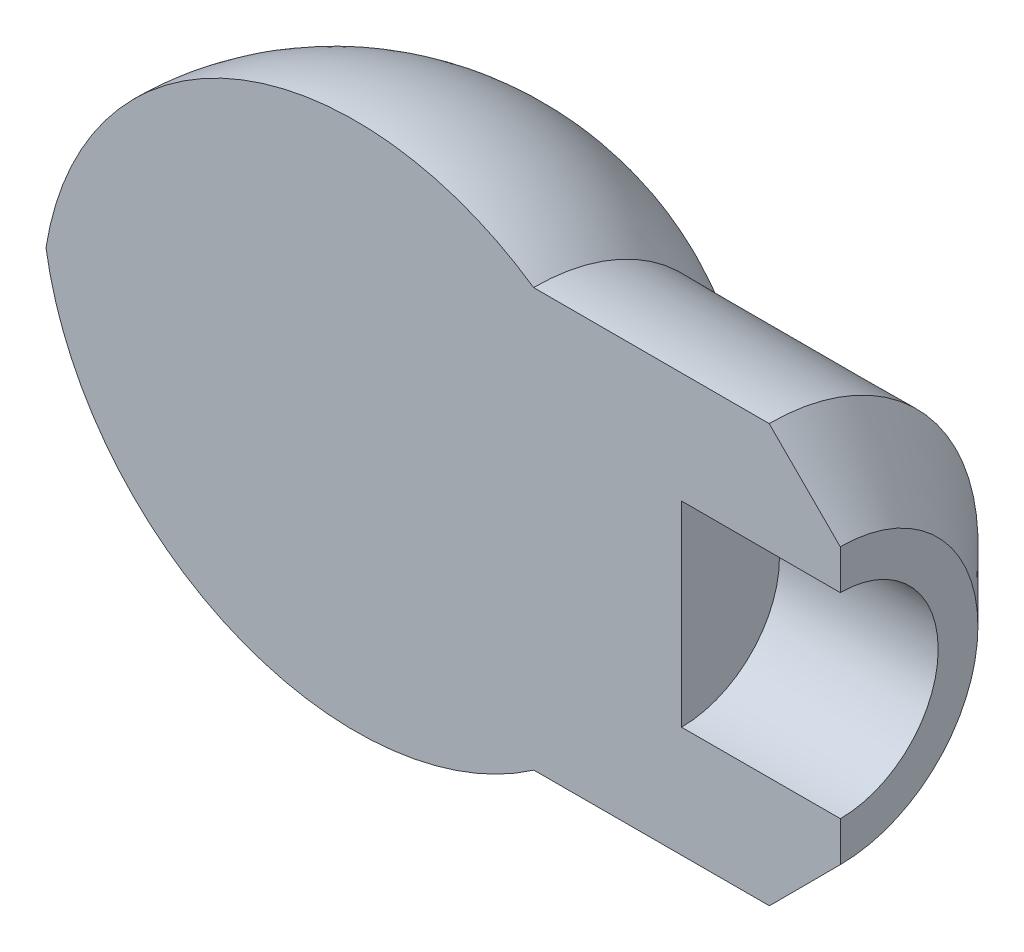
ISO-10303-21;
HEADER;
FILE_DESCRIPTION(('STEP AP214'),'2;1');
FILE_NAME('part.step','',(''),(''),'','','');
FILE_SCHEMA(('AUTOMOTIVE_DESIGN { 1 0 10303 214 1 1 1 1 }'));
ENDSEC;
DATA;
#1=APPLICATION_CONTEXT('core data for automotive mechanical design processes');
#2=APPLICATION_PROTOCOL_DEFINITION('international standard','automotive_design',2000,#1);
#3=PRODUCT_CONTEXT('',#1,'mechanical');
#4=PRODUCT('Part','Part','',(#3));
#5=PRODUCT_RELATED_PRODUCT_CATEGORY('part','',(#4));
#6=PRODUCT_DEFINITION_FORMATION('','',#4);
#7=PRODUCT_DEFINITION_CONTEXT('part definition',#1,'design');
#8=PRODUCT_DEFINITION('design','',#6,#7);
#9=PRODUCT_DEFINITION_SHAPE('','',#8);
#10=(LENGTH_UNIT() NAMED_UNIT(*) SI_UNIT(.MILLI.,.METRE.));
#11=(NAMED_UNIT(*) PLANE_ANGLE_UNIT() SI_UNIT($,.RADIAN.));
#12=(NAMED_UNIT(*) SI_UNIT($,.STERADIAN.) SOLID_ANGLE_UNIT());
#13=UNCERTAINTY_MEASURE_WITH_UNIT(LENGTH_MEASURE(1.E-05),#10,'distance_accuracy_value','');
#14=(GEOMETRIC_REPRESENTATION_CONTEXT(3) GLOBAL_UNCERTAINTY_ASSIGNED_CONTEXT((#13)) GLOBAL_UNIT_ASSIGNED_CONTEXT((#10,
#11,#12)) REPRESENTATION_CONTEXT('',''));
#15=CARTESIAN_POINT('',(0.,0.,0.));
#16=DIRECTION('',(0.,0.,1.));
#17=DIRECTION('',(1.,0.,0.));
#18=AXIS2_PLACEMENT_3D('',#15,#16,#17);
#19=CARTESIAN_POINT('',(-33.4965174206182,-17.6451469010696,0.));
#20=DIRECTION('',(0.,0.,-1.));
#21=DIRECTION('',(-0.000661234288305858,0.999999781384584,0.));
#22=AXIS2_PLACEMENT_3D('',#19,#20,#21);
#23=CIRCLE('',#22,118.378204079178);
#24=TRIMMED_CURVE('',#23,(PARAMETER_VALUE(-1.41391802301465)),
(PARAMETER_VALUE(1.41391802301465)),.T.,.PARAMETER.);
#25=CARTESIAN_POINT('',(-33.5087468767866,0.849740177748311,0.));
#26=DIRECTION('',(0.999999781384584,0.000661234288305858,0.));
#27=AXIS1_PLACEMENT('',#25,#26);
#28=SURFACE_OF_REVOLUTION('',#24,#27);
#29=CARTESIAN_POINT('',(33.7688466510365,0.894226439148994,0.));
#30=DIRECTION('',(0.999999781384584,0.000661234288305858,0.));
#31=DIRECTION('',(-0.000661234288305858,0.999999781384584,0.));
#32=AXIS2_PLACEMENT_3D('',#29,#30,#31);
#33=CIRCLE('',#32,78.9069704160235);
#34=CARTESIAN_POINT('',(33.8210226454619,-78.0127267265943,5.51004429424386E-13));
#35=VERTEX_POINT('',#34);
#36=CARTESIAN_POINT('',(33.7166706566111,79.8011796048923,0.));
#37=VERTEX_POINT('',#36);
#38=EDGE_CURVE('E11',#35,#37,#33,.T.);
#39=ORIENTED_EDGE('',*,*,#38,.F.);
#40=CARTESIAN_POINT('',(-33.520976332955,19.3446272565662,-1.29149134433399E-13));
#41=DIRECTION('',(0.,0.,-1.));
#42=DIRECTION('',(-0.999999125538432,-0.0013224682874997,0.));
#43=AXIS2_PLACEMENT_3D('',#40,#41,#42);
#44=CIRCLE('',#43,118.378204079178);
#45=CARTESIAN_POINT('',(-150.4332191906,0.772425690610211,0.));
#46=VERTEX_POINT('',#45);
#47=EDGE_CURVE('E102',#35,#46,#44,.T.);
#48=ORIENTED_EDGE('',*,*,#47,.T.);
#49=CARTESIAN_POINT('',(-33.4965174206181,-17.6451469010696,0.));
#50=DIRECTION('',(0.,0.,1.));
#51=DIRECTION('',(-1.,0.,0.));
#52=AXIS2_PLACEMENT_3D('',#49,#50,#51);
#53=CIRCLE('',#52,118.378204079178);
#54=EDGE_CURVE('E54',#37,#46,#53,.T.);
#55=ORIENTED_EDGE('',*,*,#54,.F.);
#56=EDGE_LOOP('',(#39,#48,#55));
#57=FACE_BOUND('',#56,.T.);
#58=ADVANCED_FACE('F39',(#57),#28,.T.);
#59=CARTESIAN_POINT('',(122.748807746241,0.953063053259856,0.));
#60=DIRECTION('',(-0.999999781384584,-0.000661234288305858,0.));
#61=DIRECTION('',(0.000661234288305858,-0.999999781384584,0.));
#62=AXIS2_PLACEMENT_3D('',#59,#60,#61);
#63=CONICAL_SURFACE('',#62,78.84813378905,0.000661234336491473);
#64=CARTESIAN_POINT('',(122.748807746241,0.953063053259856,0.));
#65=DIRECTION('',(0.999999781384584,0.000661234288305858,0.));
#66=DIRECTION('',(-0.000661234288305858,0.999999781384584,0.));
#67=AXIS2_PLACEMENT_3D('',#64,#65,#66);
#68=CIRCLE('',#67,78.84813378905);
#69=CARTESIAN_POINT('',(122.800944835872,-77.8950534983726,5.5059357545415E-13));
#70=VERTEX_POINT('',#69);
#71=CARTESIAN_POINT('',(122.696670656611,79.8011796048923,0.));
#72=VERTEX_POINT('',#71);
#73=EDGE_CURVE('E47',#70,#72,#68,.T.);
#74=ORIENTED_EDGE('',*,*,#73,.F.);
#75=DIRECTION('',(-0.999999125538432,-0.00132246828749985,0.));
#76=VECTOR('',#75,1.);
#77=CARTESIAN_POINT('',(122.800944835872,-77.8950534983726,5.5059357545415E-13));
#78=LINE('',#77,#76);
#79=EDGE_CURVE('E140',#70,#35,#78,.T.);
#80=ORIENTED_EDGE('',*,*,#79,.T.);
#81=ORIENTED_EDGE('',*,*,#38,.T.);
#82=DIRECTION('',(-1.,0.,0.));
#83=VECTOR('',#82,1.);
#84=CARTESIAN_POINT('',(122.696670656611,79.8011796048923,0.));
#85=LINE('',#84,#83);
#86=EDGE_CURVE('E122',#72,#37,#85,.T.);
#87=ORIENTED_EDGE('',*,*,#86,.F.);
#88=EDGE_LOOP('',(#74,#80,#81,#87));
#89=FACE_BOUND('',#88,.T.);
#90=ADVANCED_FACE('F157',(#89),#63,.T.);
#91=CARTESIAN_POINT('',(149.601086283328,0.970818704429376,0.));
#92=DIRECTION('',(-0.999999781384584,-0.000661234288305858,0.));
#93=DIRECTION('',(0.000661234288305858,-0.999999781384584,0.));
#94=AXIS2_PLACEMENT_3D('',#91,#92,#93);
#95=CONICAL_SURFACE('',#94,51.9603145747,0.786059397733935);
#96=CARTESIAN_POINT('',(149.601086283328,0.970818704429376,0.));
#97=DIRECTION('',(0.999999781384584,0.000661234288305858,0.));
#98=DIRECTION('',(-0.000661234288305858,0.999999781384584,0.));
#99=AXIS2_PLACEMENT_3D('',#96,#97,#98);
#100=CIRCLE('',#99,51.9603145747);
#101=CARTESIAN_POINT('',(149.635444224956,-50.9894845109448,3.62836937395968E-13));
#102=VERTEX_POINT('',#101);
#103=CARTESIAN_POINT('',(149.5667283417,52.9311219198036,0.));
#104=VERTEX_POINT('',#103);
#105=EDGE_CURVE('E147',#102,#104,#100,.T.);
#106=ORIENTED_EDGE('',*,*,#105,.F.);
#107=DIRECTION('',(-0.706171036554851,-0.708041289142835,0.));
#108=VECTOR('',#107,1.);
#109=CARTESIAN_POINT('',(149.635444224956,-50.9894845109448,3.62836937395968E-13));
#110=LINE('',#109,#108);
#111=EDGE_CURVE('E136',#102,#70,#110,.T.);
#112=ORIENTED_EDGE('',*,*,#111,.T.);
#113=ORIENTED_EDGE('',*,*,#73,.T.);
#114=DIRECTION('',(-0.707106781186551,0.707106781186545,0.));
#115=VECTOR('',#114,1.);
#116=CARTESIAN_POINT('',(149.5667283417,52.9311219198036,0.));
#117=LINE('',#116,#115);
#118=EDGE_CURVE('E116',#104,#72,#117,.T.);
#119=ORIENTED_EDGE('',*,*,#118,.F.);
#120=EDGE_LOOP('',(#106,#112,#113,#119));
#121=FACE_BOUND('',#120,.T.);
#122=ADVANCED_FACE('F152',(#121),#95,.T.);
#123=CARTESIAN_POINT('',(149.591167771172,0.970812145967615,0.));
#124=DIRECTION('',(0.999999781384584,0.000661234288305858,0.));
#125=DIRECTION('',(-0.000661234288305858,0.999999781384584,0.));
#126=AXIS2_PLACEMENT_3D('',#123,#124,#125);
#127=CONICAL_SURFACE('',#126,36.9603178539312,1.57013509245841);
#128=CARTESIAN_POINT('',(149.591167771172,0.970812145967615,0.));
#129=DIRECTION('',(0.999999781384584,0.000661234288305858,0.));
#130=DIRECTION('',(-0.000661234288305858,0.999999781384584,0.));
#131=AXIS2_PLACEMENT_3D('',#128,#129,#130);
#132=CIRCLE('',#131,36.9603178539312);
#133=CARTESIAN_POINT('',(149.615607200643,-35.9894976278683,2.58092520129423E-13));
#134=VERTEX_POINT('',#133);
#135=CARTESIAN_POINT('',(149.5667283417,37.9311219198036,0.));
#136=VERTEX_POINT('',#135);
#137=EDGE_CURVE('E101',#134,#136,#132,.T.);
#138=ORIENTED_EDGE('',*,*,#137,.F.);
#139=DIRECTION('',(0.0013224682874997,-0.999999125538432,0.));
#140=VECTOR('',#139,1.);
#141=CARTESIAN_POINT('',(149.615607200643,-35.9894976278683,2.58092520129423E-13));
#142=LINE('',#141,#140);
#143=EDGE_CURVE('E132',#134,#102,#142,.T.);
#144=ORIENTED_EDGE('',*,*,#143,.T.);
#145=ORIENTED_EDGE('',*,*,#105,.T.);
#146=DIRECTION('',(0.,1.,0.));
#147=VECTOR('',#146,1.);
#148=CARTESIAN_POINT('',(149.5667283417,37.9311219198036,0.));
#149=LINE('',#148,#147);
#150=EDGE_CURVE('E113',#136,#104,#149,.T.);
#151=ORIENTED_EDGE('',*,*,#150,.F.);
#152=EDGE_LOOP('',(#138,#144,#145,#151));
#153=FACE_BOUND('',#152,.T.);
#154=ADVANCED_FACE('F165',(#153),#127,.F.);
#155=CARTESIAN_POINT('',(89.5911940050188,0.931138097342624,0.));
#156=DIRECTION('',(-0.999999781384584,-0.000661234288305858,0.));
#157=DIRECTION('',(0.000661234288305858,-0.999999781384584,0.));
#158=AXIS2_PLACEMENT_3D('',#155,#156,#157);
#159=CONICAL_SURFACE('',#158,36.9999919112296,0.000661234336492099);
#160=CARTESIAN_POINT('',(89.5911940050188,0.931138097342624,0.));
#161=DIRECTION('',(0.999999781384584,0.000661234288305858,0.));
#162=DIRECTION('',(-0.000661234288305858,0.999999781384584,0.));
#163=AXIS2_PLACEMENT_3D('',#160,#161,#162);
#164=CIRCLE('',#163,36.9999919112296);
#165=CARTESIAN_POINT('',(89.6156596683375,-36.0688457251184,2.5836956259081E-13));
#166=VERTEX_POINT('',#165);
#167=CARTESIAN_POINT('',(89.5667283417,37.9311219198036,0.));
#168=VERTEX_POINT('',#167);
#169=EDGE_CURVE('E90',#166,#168,#164,.T.);
#170=ORIENTED_EDGE('',*,*,#169,.F.);
#171=DIRECTION('',(0.999999125538432,0.00132246828750062,0.));
#172=VECTOR('',#171,1.);
#173=CARTESIAN_POINT('',(89.6156596683375,-36.0688457251184,2.5836956259081E-13));
#174=LINE('',#173,#172);
#175=EDGE_CURVE('E129',#166,#134,#174,.T.);
#176=ORIENTED_EDGE('',*,*,#175,.T.);
#177=ORIENTED_EDGE('',*,*,#137,.T.);
#178=DIRECTION('',(1.,0.,0.));
#179=VECTOR('',#178,1.);
#180=CARTESIAN_POINT('',(89.5667283417,37.9311219198036,0.));
#181=LINE('',#180,#179);
#182=EDGE_CURVE('E107',#168,#136,#181,.T.);
#183=ORIENTED_EDGE('',*,*,#182,.F.);
#184=EDGE_LOOP('',(#170,#176,#177,#183));
#185=FACE_BOUND('',#184,.T.);
#186=ADVANCED_FACE('F111',(#185),#159,.F.);
#187=CARTESIAN_POINT('',(89.5667283417,0.931121919803615,0.));
#188=DIRECTION('',(0.999999781384584,0.000661234288305858,0.));
#189=DIRECTION('',(-0.000661234288305858,0.999999781384584,0.));
#190=AXIS2_PLACEMENT_3D('',#187,#188,#189);
#191=CONICAL_SURFACE('',#190,0.,1.57013509245841);
#192=DIRECTION('',(0.0013224682874997,-0.999999125538432,0.));
#193=VECTOR('',#192,1.);
#194=CARTESIAN_POINT('',(89.6156596683375,-36.0688457251184,2.5836956259081E-13));
#195=LINE('',#194,#193);
#196=CARTESIAN_POINT('',(89.5667283417,0.931121919803615,0.));
#197=VERTEX_POINT('',#196);
#198=EDGE_CURVE('E95',#197,#166,#195,.T.);
#199=ORIENTED_EDGE('',*,*,#198,.T.);
#200=ORIENTED_EDGE('',*,*,#169,.T.);
#201=DIRECTION('',(0.,1.,0.));
#202=VECTOR('',#201,1.);
#203=CARTESIAN_POINT('',(89.5667283417,37.9311219198036,0.));
#204=LINE('',#203,#202);
#205=EDGE_CURVE('E93',#197,#168,#204,.T.);
#206=ORIENTED_EDGE('',*,*,#205,.F.);
#207=EDGE_LOOP('',(#199,#200,#206));
#208=FACE_BOUND('',#207,.T.);
#209=ADVANCED_FACE('F92',(#208),#191,.F.);
#210=CARTESIAN_POINT('',(-33.520976332955,19.3446272565662,-1.29149134433399E-13));
#211=DIRECTION('',(0.,0.,1.));
#212=DIRECTION('',(-0.999999125538432,-0.0013224682874997,0.));
#213=AXIS2_PLACEMENT_3D('',#210,#211,#212);
#214=PLANE('',#213);
#215=ORIENTED_EDGE('',*,*,#198,.F.);
#216=ORIENTED_EDGE('',*,*,#205,.T.);
#217=ORIENTED_EDGE('',*,*,#182,.T.);
#218=ORIENTED_EDGE('',*,*,#150,.T.);
#219=ORIENTED_EDGE('',*,*,#118,.T.);
#220=ORIENTED_EDGE('',*,*,#86,.T.);
#221=ORIENTED_EDGE('',*,*,#54,.T.);
#222=ORIENTED_EDGE('',*,*,#47,.F.);
#223=ORIENTED_EDGE('',*,*,#79,.F.);
#224=ORIENTED_EDGE('',*,*,#111,.F.);
#225=ORIENTED_EDGE('',*,*,#143,.F.);
#226=ORIENTED_EDGE('',*,*,#175,.F.);
#227=EDGE_LOOP('',(#215,#216,#217,#218,#219,#220,#221,#222,#223,#224,#225,#226));
#228=FACE_BOUND('',#227,.T.);
#229=ADVANCED_FACE('F105',(#228),#214,.T.);
#230=CLOSED_SHELL('',(#58,#90,#122,#154,#186,#209,#229));
#231=MANIFOLD_SOLID_BREP('B2',#230);
#232=ADVANCED_BREP_SHAPE_REPRESENTATION('',(#18,#231),#14);
#233=SHAPE_DEFINITION_REPRESENTATION(#9,#232);
ENDSEC;
END-ISO-10303-21;
